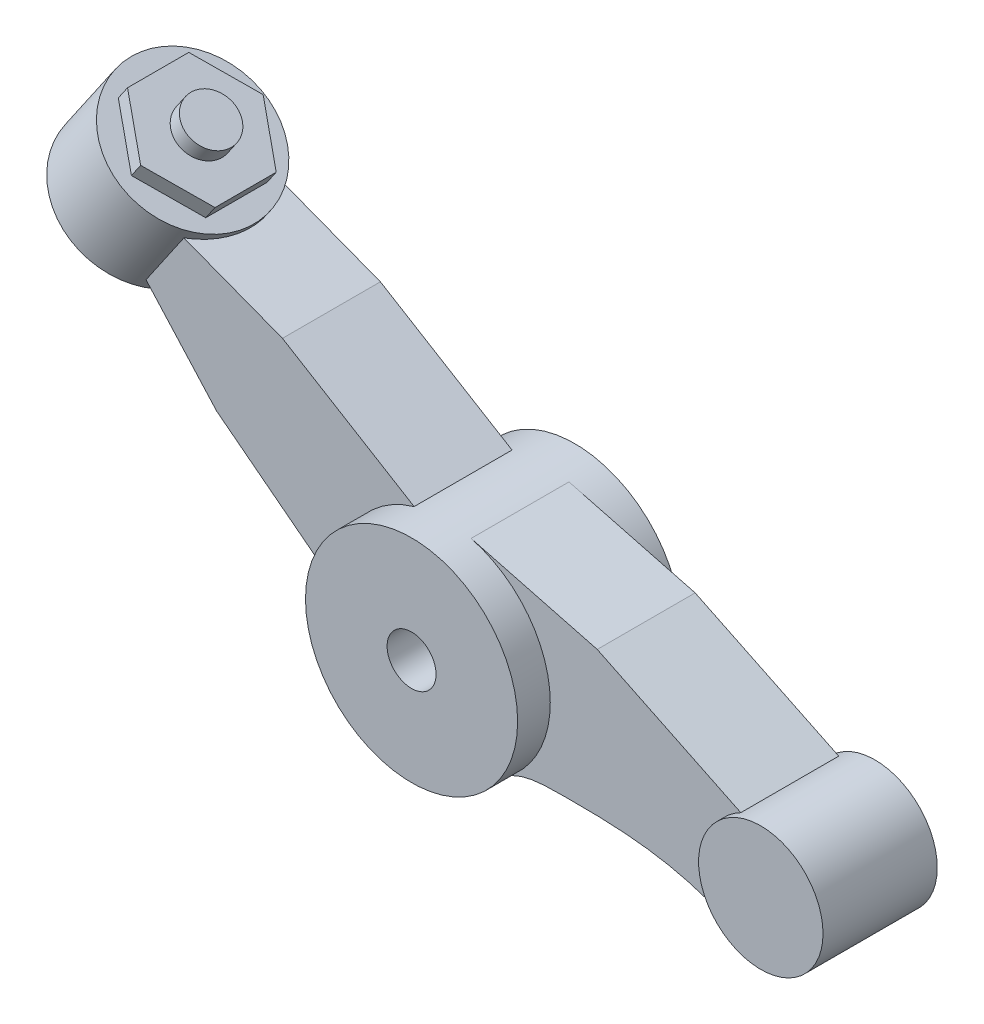
ISO-10303-21;
HEADER;
FILE_DESCRIPTION(('STEP AP214'),'2;1');
FILE_NAME('part.step','',(''),(''),'','','');
FILE_SCHEMA(('AUTOMOTIVE_DESIGN { 1 0 10303 214 1 1 1 1 }'));
ENDSEC;
DATA;
#1=APPLICATION_CONTEXT('core data for automotive mechanical design processes');
#2=APPLICATION_PROTOCOL_DEFINITION('international standard','automotive_design',2000,#1);
#3=PRODUCT_CONTEXT('',#1,'mechanical');
#4=PRODUCT('Part','Part','',(#3));
#5=PRODUCT_RELATED_PRODUCT_CATEGORY('part','',(#4));
#6=PRODUCT_DEFINITION_FORMATION('','',#4);
#7=PRODUCT_DEFINITION_CONTEXT('part definition',#1,'design');
#8=PRODUCT_DEFINITION('design','',#6,#7);
#9=PRODUCT_DEFINITION_SHAPE('','',#8);
#10=(LENGTH_UNIT() NAMED_UNIT(*) SI_UNIT(.MILLI.,.METRE.));
#11=(NAMED_UNIT(*) PLANE_ANGLE_UNIT() SI_UNIT($,.RADIAN.));
#12=(NAMED_UNIT(*) SI_UNIT($,.STERADIAN.) SOLID_ANGLE_UNIT());
#13=UNCERTAINTY_MEASURE_WITH_UNIT(LENGTH_MEASURE(1.E-05),#10,'distance_accuracy_value','');
#14=(GEOMETRIC_REPRESENTATION_CONTEXT(3) GLOBAL_UNCERTAINTY_ASSIGNED_CONTEXT((#13)) GLOBAL_UNIT_ASSIGNED_CONTEXT((#10,
#11,#12)) REPRESENTATION_CONTEXT('',''));
#15=CARTESIAN_POINT('',(0.,0.,0.));
#16=DIRECTION('',(0.,0.,1.));
#17=DIRECTION('',(1.,0.,0.));
#18=AXIS2_PLACEMENT_3D('',#15,#16,#17);
#19=CARTESIAN_POINT('',(-4.4329772935312,3.69336884842477,0.));
#20=DIRECTION('',(0.565974647839504,0.824422645251178,0.));
#21=DIRECTION('',(-0.824422645251178,0.565974647839504,0.));
#22=AXIS2_PLACEMENT_3D('',#19,#20,#21);
#23=PLANE('',#22);
#24=CARTESIAN_POINT('',(-3.68275268635263,3.17833191889082,0.));
#25=DIRECTION('',(0.565974647839504,0.824422645251178,0.));
#26=DIRECTION('',(-0.824422645251178,0.565974647839504,0.));
#27=AXIS2_PLACEMENT_3D('',#24,#25,#26);
#28=CIRCLE('',#27,0.91);
#29=CARTESIAN_POINT('',(-4.4329772935312,3.69336884842477,0.));
#30=VERTEX_POINT('',#29);
#31=EDGE_CURVE('E186',#30,#30,#28,.T.);
#32=ORIENTED_EDGE('',*,*,#31,.T.);
#33=EDGE_LOOP('',(#32));
#34=FACE_BOUND('',#33,.T.);
#35=DIRECTION('',(0.713970954242686,-0.490148422926962,-0.5));
#36=VECTOR('',#35,1.);
#37=CARTESIAN_POINT('',(-4.51335850144319,3.74855137658912,-0.168874953737966));
#38=LINE('',#37,#36);
#39=CARTESIAN_POINT('',(-4.2186274057659,3.5462154399865,-0.375277674973257));
#40=VERTEX_POINT('',#39);
#41=CARTESIAN_POINT('',(-3.68275268635263,3.17833191889082,-0.750555349946514));
#42=VERTEX_POINT('',#41);
#43=EDGE_CURVE('E44',#40,#42,#38,.T.);
#44=ORIENTED_EDGE('',*,*,#43,.T.);
#45=DIRECTION('',(0.713970954242686,-0.490148422926962,0.5));
#46=VECTOR('',#45,1.);
#47=CARTESIAN_POINT('',(-3.97748378202993,3.38066785549344,-0.956958071181804));
#48=LINE('',#47,#46);
#49=CARTESIAN_POINT('',(-3.14687796693936,2.81044839779514,-0.375277674973257));
#50=VERTEX_POINT('',#49);
#51=EDGE_CURVE('E11',#42,#50,#48,.T.);
#52=ORIENTED_EDGE('',*,*,#51,.T.);
#53=DIRECTION('',(0.,0.,1.));
#54=VECTOR('',#53,1.);
#55=CARTESIAN_POINT('',(-3.14687796693936,2.81044839779514,0.));
#56=LINE('',#55,#54);
#57=CARTESIAN_POINT('',(-3.14687796693936,2.81044839779514,0.375277674973257));
#58=VERTEX_POINT('',#57);
#59=EDGE_CURVE('E380',#50,#58,#56,.T.);
#60=ORIENTED_EDGE('',*,*,#59,.T.);
#61=DIRECTION('',(-0.713970954242686,0.490148422926962,0.5));
#62=VECTOR('',#61,1.);
#63=CARTESIAN_POINT('',(-3.97748378202993,3.38066785549344,0.956958071181805));
#64=LINE('',#63,#62);
#65=CARTESIAN_POINT('',(-3.68275268635263,3.17833191889082,0.750555349946513));
#66=VERTEX_POINT('',#65);
#67=EDGE_CURVE('E385',#58,#66,#64,.T.);
#68=ORIENTED_EDGE('',*,*,#67,.T.);
#69=DIRECTION('',(-0.713970954242686,0.490148422926962,-0.5));
#70=VECTOR('',#69,1.);
#71=CARTESIAN_POINT('',(-4.51335850144319,3.74855137658912,0.168874953737965));
#72=LINE('',#71,#70);
#73=CARTESIAN_POINT('',(-4.2186274057659,3.5462154399865,0.375277674973256));
#74=VERTEX_POINT('',#73);
#75=EDGE_CURVE('E388',#66,#74,#72,.T.);
#76=ORIENTED_EDGE('',*,*,#75,.T.);
#77=DIRECTION('',(0.,0.,-1.));
#78=VECTOR('',#77,1.);
#79=CARTESIAN_POINT('',(-4.2186274057659,3.5462154399865,0.));
#80=LINE('',#79,#78);
#81=EDGE_CURVE('E391',#74,#40,#80,.T.);
#82=ORIENTED_EDGE('',*,*,#81,.T.);
#83=EDGE_LOOP('',(#44,#52,#60,#68,#76,#82));
#84=FACE_BOUND('',#83,.T.);
#85=ADVANCED_FACE('F35',(#34,#84),#23,.T.);
#86=CARTESIAN_POINT('',(0.,0.,1.));
#87=DIRECTION('',(0.,0.,-1.));
#88=DIRECTION('',(-1.,0.,0.));
#89=AXIS2_PLACEMENT_3D('',#86,#87,#88);
#90=CYLINDRICAL_SURFACE('',#89,0.3);
#91=CARTESIAN_POINT('',(0.,0.,1.));
#92=DIRECTION('',(0.,0.,1.));
#93=DIRECTION('',(1.,0.,0.));
#94=AXIS2_PLACEMENT_3D('',#91,#92,#93);
#95=CIRCLE('',#94,0.3);
#96=CARTESIAN_POINT('',(0.3,0.,1.));
#97=VERTEX_POINT('',#96);
#98=EDGE_CURVE('E367',#97,#97,#95,.T.);
#99=ORIENTED_EDGE('',*,*,#98,.T.);
#100=EDGE_LOOP('',(#99));
#101=FACE_BOUND('',#100,.T.);
#102=CARTESIAN_POINT('',(0.,0.,-1.));
#103=DIRECTION('',(0.,0.,1.));
#104=DIRECTION('',(1.,0.,0.));
#105=AXIS2_PLACEMENT_3D('',#102,#103,#104);
#106=CIRCLE('',#105,0.3);
#107=CARTESIAN_POINT('',(0.3,0.,-1.));
#108=VERTEX_POINT('',#107);
#109=EDGE_CURVE('E366',#108,#108,#106,.T.);
#110=ORIENTED_EDGE('',*,*,#109,.F.);
#111=EDGE_LOOP('',(#110));
#112=FACE_BOUND('',#111,.T.);
#113=ADVANCED_FACE('F37',(#101,#112),#90,.F.);
#114=CARTESIAN_POINT('',(0.,0.,1.));
#115=DIRECTION('',(0.,0.,-1.));
#116=DIRECTION('',(-1.,0.,0.));
#117=AXIS2_PLACEMENT_3D('',#114,#115,#116);
#118=CYLINDRICAL_SURFACE('',#117,1.3);
#119=DIRECTION('',(0.,0.,-1.));
#120=VECTOR('',#119,1.);
#121=CARTESIAN_POINT('',(-0.368782160994087,1.24659525016444,0.6));
#122=LINE('',#121,#120);
#123=CARTESIAN_POINT('',(-0.368782160994086,1.24659525016444,0.6));
#124=VERTEX_POINT('',#123);
#125=CARTESIAN_POINT('',(-0.368782160994086,1.24659525016444,-0.6));
#126=VERTEX_POINT('',#125);
#127=EDGE_CURVE('E231',#124,#126,#122,.T.);
#128=ORIENTED_EDGE('',*,*,#127,.F.);
#129=CARTESIAN_POINT('',(0.,0.,0.6));
#130=DIRECTION('',(0.,0.,1.));
#131=DIRECTION('',(1.,0.,0.));
#132=AXIS2_PLACEMENT_3D('',#129,#130,#131);
#133=CIRCLE('',#132,1.3);
#134=CARTESIAN_POINT('',(-1.29584863415519,-0.103809042756995,0.6));
#135=VERTEX_POINT('',#134);
#136=EDGE_CURVE('E199',#124,#135,#133,.T.);
#137=ORIENTED_EDGE('',*,*,#136,.T.);
#138=DIRECTION('',(0.,0.,-1.));
#139=VECTOR('',#138,1.);
#140=CARTESIAN_POINT('',(-1.29584863415519,-0.103809042756995,0.6));
#141=LINE('',#140,#139);
#142=CARTESIAN_POINT('',(-1.29584863415519,-0.103809042756995,-0.6));
#143=VERTEX_POINT('',#142);
#144=EDGE_CURVE('E212',#135,#143,#141,.T.);
#145=ORIENTED_EDGE('',*,*,#144,.T.);
#146=CARTESIAN_POINT('',(0.,0.,-0.6));
#147=DIRECTION('',(0.,0.,1.));
#148=DIRECTION('',(1.,0.,0.));
#149=AXIS2_PLACEMENT_3D('',#146,#147,#148);
#150=CIRCLE('',#149,1.3);
#151=EDGE_CURVE('E198',#126,#143,#150,.T.);
#152=ORIENTED_EDGE('',*,*,#151,.F.);
#153=EDGE_LOOP('',(#128,#137,#145,#152));
#154=FACE_BOUND('',#153,.T.);
#155=DIRECTION('',(0.,0.,-1.));
#156=VECTOR('',#155,1.);
#157=CARTESIAN_POINT('',(0.765101996622916,-1.05100853220306,0.6));
#158=LINE('',#157,#156);
#159=CARTESIAN_POINT('',(0.765101996622916,-1.05100853220306,0.6));
#160=VERTEX_POINT('',#159);
#161=CARTESIAN_POINT('',(0.765101996622916,-1.05100853220306,-0.6));
#162=VERTEX_POINT('',#161);
#163=EDGE_CURVE('E356',#160,#162,#158,.T.);
#164=ORIENTED_EDGE('',*,*,#163,.F.);
#165=CARTESIAN_POINT('',(0.,0.,0.6));
#166=DIRECTION('',(0.,0.,1.));
#167=DIRECTION('',(1.,0.,0.));
#168=AXIS2_PLACEMENT_3D('',#165,#166,#167);
#169=CIRCLE('',#168,1.3);
#170=CARTESIAN_POINT('',(0.32933080886477,1.25759342330201,0.6));
#171=VERTEX_POINT('',#170);
#172=EDGE_CURVE('E358',#160,#171,#169,.T.);
#173=ORIENTED_EDGE('',*,*,#172,.T.);
#174=DIRECTION('',(0.,0.,-1.));
#175=VECTOR('',#174,1.);
#176=CARTESIAN_POINT('',(0.329330808864769,1.25759342330201,0.6));
#177=LINE('',#176,#175);
#178=CARTESIAN_POINT('',(0.329330808864769,1.25759342330201,-0.6));
#179=VERTEX_POINT('',#178);
#180=EDGE_CURVE('E343',#171,#179,#177,.T.);
#181=ORIENTED_EDGE('',*,*,#180,.T.);
#182=CARTESIAN_POINT('',(0.,0.,-0.6));
#183=DIRECTION('',(0.,0.,1.));
#184=DIRECTION('',(1.,0.,0.));
#185=AXIS2_PLACEMENT_3D('',#182,#183,#184);
#186=CIRCLE('',#185,1.3);
#187=EDGE_CURVE('E248',#162,#179,#186,.T.);
#188=ORIENTED_EDGE('',*,*,#187,.F.);
#189=EDGE_LOOP('',(#164,#173,#181,#188));
#190=FACE_BOUND('',#189,.T.);
#191=CARTESIAN_POINT('',(0.,0.,1.));
#192=DIRECTION('',(0.,0.,1.));
#193=DIRECTION('',(1.,0.,0.));
#194=AXIS2_PLACEMENT_3D('',#191,#192,#193);
#195=CIRCLE('',#194,1.3);
#196=CARTESIAN_POINT('',(1.3,0.,1.));
#197=VERTEX_POINT('',#196);
#198=EDGE_CURVE('E370',#197,#197,#195,.T.);
#199=ORIENTED_EDGE('',*,*,#198,.F.);
#200=EDGE_LOOP('',(#199));
#201=FACE_BOUND('',#200,.T.);
#202=CARTESIAN_POINT('',(0.,0.,-1.));
#203=DIRECTION('',(0.,0.,1.));
#204=DIRECTION('',(1.,0.,0.));
#205=AXIS2_PLACEMENT_3D('',#202,#203,#204);
#206=CIRCLE('',#205,1.3);
#207=CARTESIAN_POINT('',(1.3,0.,-1.));
#208=VERTEX_POINT('',#207);
#209=EDGE_CURVE('E371',#208,#208,#206,.T.);
#210=ORIENTED_EDGE('',*,*,#209,.T.);
#211=EDGE_LOOP('',(#210));
#212=FACE_BOUND('',#211,.T.);
#213=ADVANCED_FACE('F265',(#154,#190,#201,#212),#118,.T.);
#214=CARTESIAN_POINT('',(0.,0.,1.));
#215=DIRECTION('',(0.,0.,1.));
#216=DIRECTION('',(1.,0.,0.));
#217=AXIS2_PLACEMENT_3D('',#214,#215,#216);
#218=PLANE('',#217);
#219=ORIENTED_EDGE('',*,*,#98,.F.);
#220=EDGE_LOOP('',(#219));
#221=FACE_BOUND('',#220,.T.);
#222=ORIENTED_EDGE('',*,*,#198,.T.);
#223=EDGE_LOOP('',(#222));
#224=FACE_BOUND('',#223,.T.);
#225=ADVANCED_FACE('F262',(#221,#224),#218,.T.);
#226=CARTESIAN_POINT('',(0.,0.,-1.));
#227=DIRECTION('',(0.,0.,1.));
#228=DIRECTION('',(1.,0.,0.));
#229=AXIS2_PLACEMENT_3D('',#226,#227,#228);
#230=PLANE('',#229);
#231=ORIENTED_EDGE('',*,*,#109,.T.);
#232=EDGE_LOOP('',(#231));
#233=FACE_BOUND('',#232,.T.);
#234=ORIENTED_EDGE('',*,*,#209,.F.);
#235=EDGE_LOOP('',(#234));
#236=FACE_BOUND('',#235,.T.);
#237=ADVANCED_FACE('F259',(#233,#236),#230,.F.);
#238=CARTESIAN_POINT('',(3.43293190665739,-1.21115228630449,0.6));
#239=CARTESIAN_POINT('',(2.78269613377423,-0.92746391168016,0.6));
#240=CARTESIAN_POINT('',(1.9246700504407,-0.895659574924272,0.6));
#241=CARTESIAN_POINT('',(0.949941147115926,-0.916451296211978,0.6));
#242=CARTESIAN_POINT('',(0.765101996622916,-1.05100853220306,0.6));
#243=B_SPLINE_CURVE_WITH_KNOTS('',3,(#238,#239,#240,#241,#242),.UNSPECIFIED.,.F.,.F.,(4,1,4),
(0.,0.749641012163795,1.),.UNSPECIFIED.);
#244=DIRECTION('',(0.,0.,-1.));
#245=VECTOR('',#244,1.);
#246=SURFACE_OF_LINEAR_EXTRUSION('',#243,#245);
#247=CARTESIAN_POINT('',(3.43293190665739,-1.21115228630449,-0.6));
#248=CARTESIAN_POINT('',(2.78269613377423,-0.92746391168016,-0.6));
#249=CARTESIAN_POINT('',(1.9246700504407,-0.895659574924272,-0.6));
#250=CARTESIAN_POINT('',(0.949941147115926,-0.916451296211978,-0.6));
#251=CARTESIAN_POINT('',(0.765101996622916,-1.05100853220306,-0.6));
#252=B_SPLINE_CURVE_WITH_KNOTS('',3,(#247,#248,#249,#250,#251),.UNSPECIFIED.,.F.,.F.,(4,1,4),
(0.,0.749641012163795,1.),.UNSPECIFIED.);
#253=CARTESIAN_POINT('',(3.43293190665739,-1.21115228630449,-0.6));
#254=VERTEX_POINT('',#253);
#255=EDGE_CURVE('E238',#254,#162,#252,.T.);
#256=ORIENTED_EDGE('',*,*,#255,.F.);
#257=DIRECTION('',(0.,0.,-1.));
#258=VECTOR('',#257,1.);
#259=CARTESIAN_POINT('',(3.43293190665739,-1.21115228630449,0.6));
#260=LINE('',#259,#258);
#261=CARTESIAN_POINT('',(3.43293190665739,-1.21115228630449,0.6));
#262=VERTEX_POINT('',#261);
#263=EDGE_CURVE('E364',#262,#254,#260,.T.);
#264=ORIENTED_EDGE('',*,*,#263,.F.);
#265=EDGE_CURVE('E241',#262,#160,#243,.T.);
#266=ORIENTED_EDGE('',*,*,#265,.T.);
#267=ORIENTED_EDGE('',*,*,#163,.T.);
#268=EDGE_LOOP('',(#256,#264,#266,#267));
#269=FACE_BOUND('',#268,.T.);
#270=ADVANCED_FACE('F254',(#269),#246,.T.);
#271=CARTESIAN_POINT('',(0.691258883765189,1.42650130846445,0.6));
#272=DIRECTION('',(-0.436080364362982,-0.899907726279227,0.));
#273=DIRECTION('',(0.899907726279228,-0.436080364362982,0.));
#274=AXIS2_PLACEMENT_3D('',#271,#272,#273);
#275=PLANE('',#274);
#276=DIRECTION('',(-0.899907726279228,0.436080364362982,0.));
#277=VECTOR('',#276,1.);
#278=CARTESIAN_POINT('',(0.691258883765189,1.42650130846445,-0.6));
#279=LINE('',#278,#277);
#280=CARTESIAN_POINT('',(3.6350271749833,0.,-0.6));
#281=VERTEX_POINT('',#280);
#282=CARTESIAN_POINT('',(1.87525539926742,0.852756226822038,-0.6));
#283=VERTEX_POINT('',#282);
#284=EDGE_CURVE('E347',#281,#283,#279,.T.);
#285=ORIENTED_EDGE('',*,*,#284,.T.);
#286=DIRECTION('',(0.,0.,-1.));
#287=VECTOR('',#286,1.);
#288=CARTESIAN_POINT('',(1.87525539926742,0.852756226822038,0.6));
#289=LINE('',#288,#287);
#290=CARTESIAN_POINT('',(1.87525539926742,0.852756226822038,0.6));
#291=VERTEX_POINT('',#290);
#292=EDGE_CURVE('E345',#291,#283,#289,.T.);
#293=ORIENTED_EDGE('',*,*,#292,.F.);
#294=DIRECTION('',(-0.899907726279228,0.436080364362982,0.));
#295=VECTOR('',#294,1.);
#296=CARTESIAN_POINT('',(0.691258883765189,1.42650130846445,0.6));
#297=LINE('',#296,#295);
#298=CARTESIAN_POINT('',(3.6350271749833,0.,0.6));
#299=VERTEX_POINT('',#298);
#300=EDGE_CURVE('E692',#299,#291,#297,.T.);
#301=ORIENTED_EDGE('',*,*,#300,.F.);
#302=DIRECTION('',(0.,0.,-1.));
#303=VECTOR('',#302,1.);
#304=CARTESIAN_POINT('',(3.6350271749833,0.,0.6));
#305=LINE('',#304,#303);
#306=EDGE_CURVE('E361',#299,#281,#305,.T.);
#307=ORIENTED_EDGE('',*,*,#306,.T.);
#308=EDGE_LOOP('',(#285,#293,#301,#307));
#309=FACE_BOUND('',#308,.T.);
#310=ADVANCED_FACE('F258',(#309),#275,.F.);
#311=CARTESIAN_POINT('',(0.32933080886477,1.25759342330201,0.6));
#312=DIRECTION('',(-0.253331391434438,-0.967379556386164,0.));
#313=DIRECTION('',(0.967379556386164,-0.253331391434438,0.));
#314=AXIS2_PLACEMENT_3D('',#311,#312,#313);
#315=PLANE('',#314);
#316=DIRECTION('',(-0.967379556386164,0.253331391434438,0.));
#317=VECTOR('',#316,1.);
#318=CARTESIAN_POINT('',(0.32933080886477,1.25759342330201,-0.6));
#319=LINE('',#318,#317);
#320=EDGE_CURVE('E340',#283,#179,#319,.T.);
#321=ORIENTED_EDGE('',*,*,#320,.T.);
#322=ORIENTED_EDGE('',*,*,#180,.F.);
#323=DIRECTION('',(-0.967379556386164,0.253331391434438,0.));
#324=VECTOR('',#323,1.);
#325=CARTESIAN_POINT('',(0.32933080886477,1.25759342330201,0.6));
#326=LINE('',#325,#324);
#327=EDGE_CURVE('E690',#291,#171,#326,.T.);
#328=ORIENTED_EDGE('',*,*,#327,.F.);
#329=ORIENTED_EDGE('',*,*,#292,.T.);
#330=EDGE_LOOP('',(#321,#322,#328,#329));
#331=FACE_BOUND('',#330,.T.);
#332=ADVANCED_FACE('F326',(#331),#315,.F.);
#333=CARTESIAN_POINT('',(0.,0.,0.6));
#334=DIRECTION('',(0.,0.,1.));
#335=DIRECTION('',(1.,0.,0.));
#336=AXIS2_PLACEMENT_3D('',#333,#334,#335);
#337=PLANE('',#336);
#338=ORIENTED_EDGE('',*,*,#265,.F.);
#339=CARTESIAN_POINT('',(3.98,-0.68,0.6));
#340=DIRECTION('',(0.,0.,1.));
#341=DIRECTION('',(1.,0.,0.));
#342=AXIS2_PLACEMENT_3D('',#339,#340,#341);
#343=CIRCLE('',#342,0.7625);
#344=EDGE_CURVE('E247',#299,#262,#343,.T.);
#345=ORIENTED_EDGE('',*,*,#344,.F.);
#346=ORIENTED_EDGE('',*,*,#300,.T.);
#347=ORIENTED_EDGE('',*,*,#327,.T.);
#348=ORIENTED_EDGE('',*,*,#172,.F.);
#349=EDGE_LOOP('',(#338,#345,#346,#347,#348));
#350=FACE_BOUND('',#349,.T.);
#351=ADVANCED_FACE('F323',(#350),#337,.T.);
#352=CARTESIAN_POINT('',(0.,0.,-0.6));
#353=DIRECTION('',(0.,0.,1.));
#354=DIRECTION('',(1.,0.,0.));
#355=AXIS2_PLACEMENT_3D('',#352,#353,#354);
#356=PLANE('',#355);
#357=ORIENTED_EDGE('',*,*,#255,.T.);
#358=ORIENTED_EDGE('',*,*,#187,.T.);
#359=ORIENTED_EDGE('',*,*,#320,.F.);
#360=ORIENTED_EDGE('',*,*,#284,.F.);
#361=CARTESIAN_POINT('',(3.98,-0.68,-0.6));
#362=DIRECTION('',(0.,0.,1.));
#363=DIRECTION('',(1.,0.,0.));
#364=AXIS2_PLACEMENT_3D('',#361,#362,#363);
#365=CIRCLE('',#364,0.7625);
#366=EDGE_CURVE('E678',#281,#254,#365,.T.);
#367=ORIENTED_EDGE('',*,*,#366,.T.);
#368=EDGE_LOOP('',(#357,#358,#359,#360,#367));
#369=FACE_BOUND('',#368,.T.);
#370=ADVANCED_FACE('F321',(#369),#356,.F.);
#371=CARTESIAN_POINT('',(3.98,-0.68,0.7));
#372=DIRECTION('',(0.,0.,-1.));
#373=DIRECTION('',(-1.,0.,0.));
#374=AXIS2_PLACEMENT_3D('',#371,#372,#373);
#375=CYLINDRICAL_SURFACE('',#374,0.7625);
#376=ORIENTED_EDGE('',*,*,#344,.T.);
#377=ORIENTED_EDGE('',*,*,#263,.T.);
#378=ORIENTED_EDGE('',*,*,#366,.F.);
#379=ORIENTED_EDGE('',*,*,#306,.F.);
#380=EDGE_LOOP('',(#376,#377,#378,#379));
#381=FACE_BOUND('',#380,.T.);
#382=CARTESIAN_POINT('',(3.98,-0.68,0.7));
#383=DIRECTION('',(0.,0.,1.));
#384=DIRECTION('',(1.,0.,0.));
#385=AXIS2_PLACEMENT_3D('',#382,#383,#384);
#386=CIRCLE('',#385,0.7625);
#387=CARTESIAN_POINT('',(4.7425,-0.68,0.7));
#388=VERTEX_POINT('',#387);
#389=EDGE_CURVE('E235',#388,#388,#386,.T.);
#390=ORIENTED_EDGE('',*,*,#389,.F.);
#391=EDGE_LOOP('',(#390));
#392=FACE_BOUND('',#391,.T.);
#393=CARTESIAN_POINT('',(3.98,-0.68,-0.7));
#394=DIRECTION('',(0.,0.,1.));
#395=DIRECTION('',(1.,0.,0.));
#396=AXIS2_PLACEMENT_3D('',#393,#394,#395);
#397=CIRCLE('',#396,0.7625);
#398=CARTESIAN_POINT('',(4.7425,-0.68,-0.7));
#399=VERTEX_POINT('',#398);
#400=EDGE_CURVE('E234',#399,#399,#397,.T.);
#401=ORIENTED_EDGE('',*,*,#400,.T.);
#402=EDGE_LOOP('',(#401));
#403=FACE_BOUND('',#402,.T.);
#404=ADVANCED_FACE('F314',(#381,#392,#403),#375,.T.);
#405=CARTESIAN_POINT('',(0.,0.,0.7));
#406=DIRECTION('',(0.,0.,1.));
#407=DIRECTION('',(1.,0.,0.));
#408=AXIS2_PLACEMENT_3D('',#405,#406,#407);
#409=PLANE('',#408);
#410=ORIENTED_EDGE('',*,*,#389,.T.);
#411=EDGE_LOOP('',(#410));
#412=FACE_BOUND('',#411,.T.);
#413=ADVANCED_FACE('F311',(#412),#409,.T.);
#414=CARTESIAN_POINT('',(0.,0.,-0.7));
#415=DIRECTION('',(0.,0.,1.));
#416=DIRECTION('',(1.,0.,0.));
#417=AXIS2_PLACEMENT_3D('',#414,#415,#416);
#418=PLANE('',#417);
#419=ORIENTED_EDGE('',*,*,#400,.F.);
#420=EDGE_LOOP('',(#419));
#421=FACE_BOUND('',#420,.T.);
#422=ADVANCED_FACE('F309',(#421),#418,.F.);
#423=CARTESIAN_POINT('',(0.45361206525151,0.747603642695811,0.6));
#424=DIRECTION('',(0.518735678530968,0.854934673421903,0.));
#425=DIRECTION('',(-0.854934673421903,0.518735678530968,0.));
#426=AXIS2_PLACEMENT_3D('',#423,#424,#425);
#427=PLANE('',#426);
#428=DIRECTION('',(0.854934673421903,-0.518735678530968,0.));
#429=VECTOR('',#428,1.);
#430=CARTESIAN_POINT('',(0.45361206525151,0.747603642695811,-0.6));
#431=LINE('',#430,#429);
#432=CARTESIAN_POINT('',(-1.9821949842316,2.2255411528529,-0.6));
#433=VERTEX_POINT('',#432);
#434=EDGE_CURVE('E215',#433,#126,#431,.T.);
#435=ORIENTED_EDGE('',*,*,#434,.F.);
#436=DIRECTION('',(0.,0.,-1.));
#437=VECTOR('',#436,1.);
#438=CARTESIAN_POINT('',(-1.9821949842316,2.2255411528529,0.6));
#439=LINE('',#438,#437);
#440=CARTESIAN_POINT('',(-1.9821949842316,2.2255411528529,0.6));
#441=VERTEX_POINT('',#440);
#442=EDGE_CURVE('E228',#441,#433,#439,.T.);
#443=ORIENTED_EDGE('',*,*,#442,.F.);
#444=DIRECTION('',(0.854934673421903,-0.518735678530968,0.));
#445=VECTOR('',#444,1.);
#446=CARTESIAN_POINT('',(0.45361206525151,0.747603642695811,0.6));
#447=LINE('',#446,#445);
#448=EDGE_CURVE('E201',#441,#124,#447,.T.);
#449=ORIENTED_EDGE('',*,*,#448,.T.);
#450=ORIENTED_EDGE('',*,*,#127,.T.);
#451=EDGE_LOOP('',(#435,#443,#449,#450));
#452=FACE_BOUND('',#451,.T.);
#453=ADVANCED_FACE('F305',(#452),#427,.T.);
#454=CARTESIAN_POINT('',(0.489501886245422,1.28116913768826,0.6));
#455=DIRECTION('',(0.356910419352875,0.934138615280064,0.));
#456=DIRECTION('',(-0.934138615280064,0.356910419352875,0.));
#457=AXIS2_PLACEMENT_3D('',#454,#455,#456);
#458=PLANE('',#457);
#459=CARTESIAN_POINT('',(-3.84756940660758,2.93825290296157,0.));
#460=DIRECTION('',(0.356910419352875,0.934138615280064,0.));
#461=DIRECTION('',(0.934138615280064,-0.356910419352875,0.));
#462=AXIS2_PLACEMENT_3D('',#459,#460,#461);
#463=ELLIPSE('',#462,0.936091416623468,0.91);
#464=CARTESIAN_POINT('',(-3.19012729843187,2.68706112618347,0.6));
#465=VERTEX_POINT('',#464);
#466=CARTESIAN_POINT('',(-3.19012729843187,2.68706112618347,-0.6));
#467=VERTEX_POINT('',#466);
#468=EDGE_CURVE('E59',#465,#467,#463,.T.);
#469=ORIENTED_EDGE('',*,*,#468,.F.);
#470=DIRECTION('',(0.934138615280064,-0.356910419352875,0.));
#471=VECTOR('',#470,1.);
#472=CARTESIAN_POINT('',(0.489501886245422,1.28116913768826,0.6));
#473=LINE('',#472,#471);
#474=EDGE_CURVE('E205',#465,#441,#473,.T.);
#475=ORIENTED_EDGE('',*,*,#474,.T.);
#476=ORIENTED_EDGE('',*,*,#442,.T.);
#477=DIRECTION('',(0.934138615280064,-0.356910419352875,0.));
#478=VECTOR('',#477,1.);
#479=CARTESIAN_POINT('',(0.489501886245422,1.28116913768826,-0.6));
#480=LINE('',#479,#478);
#481=EDGE_CURVE('E218',#467,#433,#480,.T.);
#482=ORIENTED_EDGE('',*,*,#481,.F.);
#483=EDGE_LOOP('',(#469,#475,#476,#482));
#484=FACE_BOUND('',#483,.T.);
#485=ADVANCED_FACE('F301',(#484),#458,.T.);
#486=CARTESIAN_POINT('',(-1.01969272531976,-0.917187659060386,0.6));
#487=DIRECTION('',(0.743488367320575,0.668748867407628,0.));
#488=DIRECTION('',(-0.668748867407628,0.743488367320576,0.));
#489=AXIS2_PLACEMENT_3D('',#486,#487,#488);
#490=PLANE('',#489);
#491=DIRECTION('',(0.668748867407628,-0.743488367320576,0.));
#492=VECTOR('',#491,1.);
#493=CARTESIAN_POINT('',(-1.01969272531976,-0.917187659060386,0.6));
#494=LINE('',#493,#492);
#495=CARTESIAN_POINT('',(-3.6539354484891,2.01145852910801,0.6));
#496=VERTEX_POINT('',#495);
#497=CARTESIAN_POINT('',(-2.78917795552933,1.05005557516924,0.6));
#498=VERTEX_POINT('',#497);
#499=EDGE_CURVE('E207',#496,#498,#494,.T.);
#500=ORIENTED_EDGE('',*,*,#499,.F.);
#501=CARTESIAN_POINT('',(-4.12459757297132,2.53472194164643,0.));
#502=DIRECTION('',(0.743488367320575,0.668748867407628,0.));
#503=DIRECTION('',(-0.668748867407628,0.743488367320576,0.));
#504=AXIS2_PLACEMENT_3D('',#501,#502,#503);
#505=ELLIPSE('',#504,0.936091416623468,0.91);
#506=CARTESIAN_POINT('',(-3.6539354484891,2.01145852910801,-0.6));
#507=VERTEX_POINT('',#506);
#508=EDGE_CURVE('E192',#496,#507,#505,.T.);
#509=ORIENTED_EDGE('',*,*,#508,.T.);
#510=DIRECTION('',(0.668748867407628,-0.743488367320576,0.));
#511=VECTOR('',#510,1.);
#512=CARTESIAN_POINT('',(-1.01969272531976,-0.917187659060386,-0.6));
#513=LINE('',#512,#511);
#514=CARTESIAN_POINT('',(-2.78917795552933,1.05005557516924,-0.6));
#515=VERTEX_POINT('',#514);
#516=EDGE_CURVE('E220',#507,#515,#513,.T.);
#517=ORIENTED_EDGE('',*,*,#516,.T.);
#518=DIRECTION('',(0.,0.,-1.));
#519=VECTOR('',#518,1.);
#520=CARTESIAN_POINT('',(-2.78917795552933,1.05005557516924,0.6));
#521=LINE('',#520,#519);
#522=EDGE_CURVE('E225',#498,#515,#521,.T.);
#523=ORIENTED_EDGE('',*,*,#522,.F.);
#524=EDGE_LOOP('',(#500,#509,#517,#523));
#525=FACE_BOUND('',#524,.T.);
#526=ADVANCED_FACE('F297',(#525),#490,.F.);
#527=CARTESIAN_POINT('',(-0.534663775516847,-0.691960807751318,0.6));
#528=DIRECTION('',(0.611423720012565,0.791303377097556,0.));
#529=DIRECTION('',(-0.791303377097556,0.611423720012565,0.));
#530=AXIS2_PLACEMENT_3D('',#527,#528,#529);
#531=PLANE('',#530);
#532=DIRECTION('',(0.791303377097556,-0.611423720012565,0.));
#533=VECTOR('',#532,1.);
#534=CARTESIAN_POINT('',(-0.534663775516847,-0.691960807751318,-0.6));
#535=LINE('',#534,#533);
#536=EDGE_CURVE('E202',#515,#143,#535,.T.);
#537=ORIENTED_EDGE('',*,*,#536,.T.);
#538=ORIENTED_EDGE('',*,*,#144,.F.);
#539=DIRECTION('',(0.791303377097556,-0.611423720012565,0.));
#540=VECTOR('',#539,1.);
#541=CARTESIAN_POINT('',(-0.534663775516847,-0.691960807751318,0.6));
#542=LINE('',#541,#540);
#543=EDGE_CURVE('E209',#498,#135,#542,.T.);
#544=ORIENTED_EDGE('',*,*,#543,.F.);
#545=ORIENTED_EDGE('',*,*,#522,.T.);
#546=EDGE_LOOP('',(#537,#538,#544,#545));
#547=FACE_BOUND('',#546,.T.);
#548=ADVANCED_FACE('F290',(#547),#531,.F.);
#549=CARTESIAN_POINT('',(0.,0.,0.6));
#550=DIRECTION('',(0.,0.,1.));
#551=DIRECTION('',(1.,0.,0.));
#552=AXIS2_PLACEMENT_3D('',#549,#550,#551);
#553=PLANE('',#552);
#554=DIRECTION('',(0.565974647839504,0.824422645251178,0.));
#555=VECTOR('',#554,1.);
#556=CARTESIAN_POINT('',(-3.11870057002367,2.79110432423256,0.6));
#557=LINE('',#556,#555);
#558=EDGE_CURVE('E196',#496,#465,#557,.T.);
#559=ORIENTED_EDGE('',*,*,#558,.F.);
#560=ORIENTED_EDGE('',*,*,#499,.T.);
#561=ORIENTED_EDGE('',*,*,#543,.T.);
#562=ORIENTED_EDGE('',*,*,#136,.F.);
#563=ORIENTED_EDGE('',*,*,#448,.F.);
#564=ORIENTED_EDGE('',*,*,#474,.F.);
#565=EDGE_LOOP('',(#559,#560,#561,#562,#563,#564));
#566=FACE_BOUND('',#565,.T.);
#567=ADVANCED_FACE('F286',(#566),#553,.T.);
#568=CARTESIAN_POINT('',(0.,0.,-0.6));
#569=DIRECTION('',(0.,0.,1.));
#570=DIRECTION('',(1.,0.,0.));
#571=AXIS2_PLACEMENT_3D('',#568,#569,#570);
#572=PLANE('',#571);
#573=ORIENTED_EDGE('',*,*,#516,.F.);
#574=DIRECTION('',(0.565974647839504,0.824422645251178,0.));
#575=VECTOR('',#574,1.);
#576=CARTESIAN_POINT('',(-3.11870057002367,2.79110432423256,-0.6));
#577=LINE('',#576,#575);
#578=EDGE_CURVE('E374',#507,#467,#577,.T.);
#579=ORIENTED_EDGE('',*,*,#578,.T.);
#580=ORIENTED_EDGE('',*,*,#481,.T.);
#581=ORIENTED_EDGE('',*,*,#434,.T.);
#582=ORIENTED_EDGE('',*,*,#151,.T.);
#583=ORIENTED_EDGE('',*,*,#536,.F.);
#584=EDGE_LOOP('',(#573,#579,#580,#581,#582,#583));
#585=FACE_BOUND('',#584,.T.);
#586=ADVANCED_FACE('F289',(#585),#572,.F.);
#587=CARTESIAN_POINT('',(-4.29174140742793,2.29125315260055,0.));
#588=DIRECTION('',(-0.565974647839504,-0.824422645251178,0.));
#589=DIRECTION('',(0.824422645251178,-0.565974647839504,0.));
#590=AXIS2_PLACEMENT_3D('',#587,#588,#589);
#591=PLANE('',#590);
#592=CARTESIAN_POINT('',(-4.29174140742793,2.29125315260055,0.));
#593=DIRECTION('',(-0.565974647839504,-0.824422645251178,0.));
#594=DIRECTION('',(0.824422645251178,-0.565974647839504,0.));
#595=AXIS2_PLACEMENT_3D('',#592,#593,#594);
#596=CIRCLE('',#595,0.268342888439798);
#597=CARTESIAN_POINT('',(-4.07051345350605,2.1393778808156,0.));
#598=VERTEX_POINT('',#597);
#599=EDGE_CURVE('E180',#598,#598,#596,.F.);
#600=ORIENTED_EDGE('',*,*,#599,.T.);
#601=EDGE_LOOP('',(#600));
#602=FACE_BOUND('',#601,.T.);
#603=CARTESIAN_POINT('',(-4.29174140742793,2.29125315260055,0.));
#604=DIRECTION('',(0.565974647839504,0.824422645251178,0.));
#605=DIRECTION('',(-0.824422645251178,0.565974647839504,0.));
#606=AXIS2_PLACEMENT_3D('',#603,#604,#605);
#607=CIRCLE('',#606,0.91);
#608=CARTESIAN_POINT('',(-5.04196601460651,2.8062900821345,0.));
#609=VERTEX_POINT('',#608);
#610=EDGE_CURVE('E189',#609,#609,#607,.T.);
#611=ORIENTED_EDGE('',*,*,#610,.F.);
#612=EDGE_LOOP('',(#611));
#613=FACE_BOUND('',#612,.T.);
#614=ADVANCED_FACE('F284',(#602,#613),#591,.T.);
#615=CARTESIAN_POINT('',(-3.68275268635263,3.17833191889082,0.));
#616=DIRECTION('',(0.565974647839504,0.824422645251178,0.));
#617=DIRECTION('',(-0.824422645251178,0.565974647839504,0.));
#618=AXIS2_PLACEMENT_3D('',#615,#616,#617);
#619=CYLINDRICAL_SURFACE('',#618,0.91);
#620=ORIENTED_EDGE('',*,*,#508,.F.);
#621=ORIENTED_EDGE('',*,*,#558,.T.);
#622=ORIENTED_EDGE('',*,*,#468,.T.);
#623=ORIENTED_EDGE('',*,*,#578,.F.);
#624=EDGE_LOOP('',(#620,#621,#622,#623));
#625=FACE_BOUND('',#624,.T.);
#626=ORIENTED_EDGE('',*,*,#610,.T.);
#627=EDGE_LOOP('',(#626));
#628=FACE_BOUND('',#627,.T.);
#629=ORIENTED_EDGE('',*,*,#31,.F.);
#630=EDGE_LOOP('',(#629));
#631=FACE_BOUND('',#630,.T.);
#632=ADVANCED_FACE('F444',(#625,#628,#631),#619,.T.);
#633=CARTESIAN_POINT('',(-4.44355713905914,2.07011192738858,0.));
#634=DIRECTION('',(0.565974647839503,0.824422645251179,0.));
#635=DIRECTION('',(-0.824422645251179,0.565974647839503,0.));
#636=AXIS2_PLACEMENT_3D('',#633,#634,#635);
#637=CONICAL_SURFACE('',#636,0.0985192542995596,0.564409104137141);
#638=ORIENTED_EDGE('',*,*,#599,.F.);
#639=EDGE_LOOP('',(#638));
#640=FACE_BOUND('',#639,.T.);
#641=CARTESIAN_POINT('',(-4.44355713905914,2.07011192738858,0.));
#642=DIRECTION('',(0.565974647839503,0.824422645251179,0.));
#643=DIRECTION('',(-0.824422645251179,0.565974647839503,0.));
#644=AXIS2_PLACEMENT_3D('',#641,#642,#643);
#645=CIRCLE('',#644,0.0985192542995593);
#646=CARTESIAN_POINT('',(-4.52477864329696,2.12587132764618,0.));
#647=VERTEX_POINT('',#646);
#648=EDGE_CURVE('E177',#647,#647,#645,.T.);
#649=ORIENTED_EDGE('',*,*,#648,.T.);
#650=EDGE_LOOP('',(#649));
#651=FACE_BOUND('',#650,.T.);
#652=ADVANCED_FACE('F441',(#640,#651),#637,.T.);
#653=CARTESIAN_POINT('',(-4.6336386578282,1.79323113579279,0.));
#654=DIRECTION('',(0.565974647839503,0.824422645251179,0.));
#655=DIRECTION('',(0.824422645251179,-0.565974647839503,0.));
#656=AXIS2_PLACEMENT_3D('',#653,#654,#655);
#657=SPHERICAL_SURFACE('',#656,0.35);
#658=ORIENTED_EDGE('',*,*,#648,.F.);
#659=EDGE_LOOP('',(#658));
#660=FACE_BOUND('',#659,.T.);
#661=ADVANCED_FACE('F438',(#660),#657,.T.);
#662=CARTESIAN_POINT('',(-3.03368303737146,2.97533292684538,-0.375277674973257));
#663=DIRECTION('',(-0.412211322625589,0.282987323919752,0.866025403784438));
#664=DIRECTION('',(0.902934052856613,0.,0.429779124890835));
#665=AXIS2_PLACEMENT_3D('',#662,#663,#664);
#666=PLANE('',#665);
#667=ORIENTED_EDGE('',*,*,#51,.F.);
#668=DIRECTION('',(-0.565974647839504,-0.824422645251178,0.));
#669=VECTOR('',#668,1.);
#670=CARTESIAN_POINT('',(-3.56955775678473,3.34321644794105,-0.750555349946514));
#671=LINE('',#670,#669);
#672=CARTESIAN_POINT('',(-3.56955775678473,3.34321644794105,-0.750555349946514));
#673=VERTEX_POINT('',#672);
#674=EDGE_CURVE('E160',#673,#42,#671,.T.);
#675=ORIENTED_EDGE('',*,*,#674,.F.);
#676=DIRECTION('',(-0.713970954242686,0.490148422926962,-0.5));
#677=VECTOR('',#676,1.);
#678=CARTESIAN_POINT('',(-3.03368303737146,2.97533292684538,-0.375277674973257));
#679=LINE('',#678,#677);
#680=CARTESIAN_POINT('',(-3.03368303737146,2.97533292684538,-0.375277674973257));
#681=VERTEX_POINT('',#680);
#682=EDGE_CURVE('E167',#681,#673,#679,.T.);
#683=ORIENTED_EDGE('',*,*,#682,.F.);
#684=DIRECTION('',(-0.565974647839504,-0.824422645251178,0.));
#685=VECTOR('',#684,1.);
#686=CARTESIAN_POINT('',(-3.03368303737146,2.97533292684538,-0.375277674973257));
#687=LINE('',#686,#685);
#688=EDGE_CURVE('E406',#681,#50,#687,.T.);
#689=ORIENTED_EDGE('',*,*,#688,.T.);
#690=EDGE_LOOP('',(#667,#675,#683,#689));
#691=FACE_BOUND('',#690,.T.);
#692=ADVANCED_FACE('F176',(#691),#666,.F.);
#693=CARTESIAN_POINT('',(-3.56955775678473,3.34321644794105,-0.750555349946514));
#694=DIRECTION('',(0.412211322625589,-0.282987323919752,0.866025403784439));
#695=DIRECTION('',(0.902934052856613,0.,-0.429779124890835));
#696=AXIS2_PLACEMENT_3D('',#693,#694,#695);
#697=PLANE('',#696);
#698=ORIENTED_EDGE('',*,*,#43,.F.);
#699=DIRECTION('',(-0.565974647839504,-0.824422645251178,0.));
#700=VECTOR('',#699,1.);
#701=CARTESIAN_POINT('',(-4.10543247619799,3.71109996903673,-0.375277674973257));
#702=LINE('',#701,#700);
#703=CARTESIAN_POINT('',(-4.10543247619799,3.71109996903673,-0.375277674973257));
#704=VERTEX_POINT('',#703);
#705=EDGE_CURVE('E163',#704,#40,#702,.T.);
#706=ORIENTED_EDGE('',*,*,#705,.F.);
#707=DIRECTION('',(-0.713970954242686,0.490148422926962,0.5));
#708=VECTOR('',#707,1.);
#709=CARTESIAN_POINT('',(-3.56955775678473,3.34321644794105,-0.750555349946514));
#710=LINE('',#709,#708);
#711=EDGE_CURVE('E156',#673,#704,#710,.T.);
#712=ORIENTED_EDGE('',*,*,#711,.F.);
#713=ORIENTED_EDGE('',*,*,#674,.T.);
#714=EDGE_LOOP('',(#698,#706,#712,#713));
#715=FACE_BOUND('',#714,.T.);
#716=ADVANCED_FACE('F158',(#715),#697,.F.);
#717=CARTESIAN_POINT('',(-4.10543247619799,3.71109996903673,-0.375277674973257));
#718=DIRECTION('',(0.824422645251178,-0.565974647839504,0.));
#719=DIRECTION('',(0.565974647839504,0.824422645251178,0.));
#720=AXIS2_PLACEMENT_3D('',#717,#718,#719);
#721=PLANE('',#720);
#722=ORIENTED_EDGE('',*,*,#81,.F.);
#723=DIRECTION('',(-0.565974647839504,-0.824422645251178,0.));
#724=VECTOR('',#723,1.);
#725=CARTESIAN_POINT('',(-4.10543247619799,3.71109996903673,0.375277674973256));
#726=LINE('',#725,#724);
#727=CARTESIAN_POINT('',(-4.10543247619799,3.71109996903673,0.375277674973256));
#728=VERTEX_POINT('',#727);
#729=EDGE_CURVE('E182',#728,#74,#726,.T.);
#730=ORIENTED_EDGE('',*,*,#729,.F.);
#731=DIRECTION('',(0.,0.,1.));
#732=VECTOR('',#731,1.);
#733=CARTESIAN_POINT('',(-4.10543247619799,3.71109996903673,-0.375277674973257));
#734=LINE('',#733,#732);
#735=EDGE_CURVE('E166',#704,#728,#734,.T.);
#736=ORIENTED_EDGE('',*,*,#735,.F.);
#737=ORIENTED_EDGE('',*,*,#705,.T.);
#738=EDGE_LOOP('',(#722,#730,#736,#737));
#739=FACE_BOUND('',#738,.T.);
#740=ADVANCED_FACE('F395',(#739),#721,.F.);
#741=CARTESIAN_POINT('',(-4.10543247619799,3.71109996903673,0.375277674973256));
#742=DIRECTION('',(0.412211322625589,-0.282987323919752,-0.866025403784438));
#743=DIRECTION('',(-0.902934052856613,0.,-0.429779124890835));
#744=AXIS2_PLACEMENT_3D('',#741,#742,#743);
#745=PLANE('',#744);
#746=ORIENTED_EDGE('',*,*,#75,.F.);
#747=DIRECTION('',(-0.565974647839504,-0.824422645251178,0.));
#748=VECTOR('',#747,1.);
#749=CARTESIAN_POINT('',(-3.56955775678473,3.34321644794105,0.750555349946513));
#750=LINE('',#749,#748);
#751=CARTESIAN_POINT('',(-3.56955775678473,3.34321644794105,0.750555349946513));
#752=VERTEX_POINT('',#751);
#753=EDGE_CURVE('E409',#752,#66,#750,.T.);
#754=ORIENTED_EDGE('',*,*,#753,.F.);
#755=DIRECTION('',(0.713970954242686,-0.490148422926962,0.5));
#756=VECTOR('',#755,1.);
#757=CARTESIAN_POINT('',(-4.10543247619799,3.71109996903673,0.375277674973256));
#758=LINE('',#757,#756);
#759=EDGE_CURVE('E399',#728,#752,#758,.T.);
#760=ORIENTED_EDGE('',*,*,#759,.F.);
#761=ORIENTED_EDGE('',*,*,#729,.T.);
#762=EDGE_LOOP('',(#746,#754,#760,#761));
#763=FACE_BOUND('',#762,.T.);
#764=ADVANCED_FACE('F412',(#763),#745,.F.);
#765=CARTESIAN_POINT('',(-3.56955775678473,3.34321644794105,0.750555349946513));
#766=DIRECTION('',(-0.412211322625589,0.282987323919752,-0.866025403784438));
#767=DIRECTION('',(-0.902934052856613,0.,0.429779124890835));
#768=AXIS2_PLACEMENT_3D('',#765,#766,#767);
#769=PLANE('',#768);
#770=ORIENTED_EDGE('',*,*,#67,.F.);
#771=DIRECTION('',(-0.565974647839504,-0.824422645251178,0.));
#772=VECTOR('',#771,1.);
#773=CARTESIAN_POINT('',(-3.03368303737146,2.97533292684538,0.375277674973257));
#774=LINE('',#773,#772);
#775=CARTESIAN_POINT('',(-3.03368303737146,2.97533292684538,0.375277674973257));
#776=VERTEX_POINT('',#775);
#777=EDGE_CURVE('E51',#776,#58,#774,.T.);
#778=ORIENTED_EDGE('',*,*,#777,.F.);
#779=DIRECTION('',(0.713970954242687,-0.490148422926961,-0.5));
#780=VECTOR('',#779,1.);
#781=CARTESIAN_POINT('',(-3.56955775678473,3.34321644794105,0.750555349946513));
#782=LINE('',#781,#780);
#783=EDGE_CURVE('E401',#752,#776,#782,.T.);
#784=ORIENTED_EDGE('',*,*,#783,.F.);
#785=ORIENTED_EDGE('',*,*,#753,.T.);
#786=EDGE_LOOP('',(#770,#778,#784,#785));
#787=FACE_BOUND('',#786,.T.);
#788=ADVANCED_FACE('F415',(#787),#769,.F.);
#789=CARTESIAN_POINT('',(-3.03368303737146,2.97533292684538,0.375277674973257));
#790=DIRECTION('',(-0.824422645251178,0.565974647839504,0.));
#791=DIRECTION('',(-0.565974647839504,-0.824422645251178,0.));
#792=AXIS2_PLACEMENT_3D('',#789,#790,#791);
#793=PLANE('',#792);
#794=ORIENTED_EDGE('',*,*,#59,.F.);
#795=ORIENTED_EDGE('',*,*,#688,.F.);
#796=DIRECTION('',(0.,0.,-1.));
#797=VECTOR('',#796,1.);
#798=CARTESIAN_POINT('',(-3.03368303737146,2.97533292684538,0.375277674973257));
#799=LINE('',#798,#797);
#800=EDGE_CURVE('E171',#776,#681,#799,.T.);
#801=ORIENTED_EDGE('',*,*,#800,.F.);
#802=ORIENTED_EDGE('',*,*,#777,.T.);
#803=EDGE_LOOP('',(#794,#795,#801,#802));
#804=FACE_BOUND('',#803,.T.);
#805=ADVANCED_FACE('F417',(#804),#793,.F.);
#806=CARTESIAN_POINT('',(0.416525733004718,0.606729025637052,0.));
#807=DIRECTION('',(0.565974647839504,0.824422645251178,0.));
#808=DIRECTION('',(-0.824422645251178,0.565974647839504,0.));
#809=AXIS2_PLACEMENT_3D('',#806,#807,#808);
#810=PLANE('',#809);
#811=CARTESIAN_POINT('',(-3.56955775678473,3.34321644794105,0.));
#812=DIRECTION('',(0.565974647839504,0.824422645251178,0.));
#813=DIRECTION('',(-0.824422645251178,0.565974647839504,0.));
#814=AXIS2_PLACEMENT_3D('',#811,#812,#813);
#815=CIRCLE('',#814,0.3);
#816=CARTESIAN_POINT('',(-3.81688455036008,3.5130088422929,0.));
#817=VERTEX_POINT('',#816);
#818=EDGE_CURVE('E39',#817,#817,#815,.F.);
#819=ORIENTED_EDGE('',*,*,#818,.T.);
#820=EDGE_LOOP('',(#819));
#821=FACE_BOUND('',#820,.T.);
#822=ORIENTED_EDGE('',*,*,#682,.T.);
#823=ORIENTED_EDGE('',*,*,#711,.T.);
#824=ORIENTED_EDGE('',*,*,#735,.T.);
#825=ORIENTED_EDGE('',*,*,#759,.T.);
#826=ORIENTED_EDGE('',*,*,#783,.T.);
#827=ORIENTED_EDGE('',*,*,#800,.T.);
#828=EDGE_LOOP('',(#822,#823,#824,#825,#826,#827));
#829=FACE_BOUND('',#828,.T.);
#830=ADVANCED_FACE('F170',(#821,#829),#810,.T.);
#831=CARTESIAN_POINT('',(-3.45636282721683,3.50810097699129,0.));
#832=DIRECTION('',(-0.565974647839504,-0.824422645251178,0.));
#833=DIRECTION('',(0.824422645251178,-0.565974647839504,0.));
#834=AXIS2_PLACEMENT_3D('',#831,#832,#833);
#835=CYLINDRICAL_SURFACE('',#834,0.3);
#836=ORIENTED_EDGE('',*,*,#818,.F.);
#837=EDGE_LOOP('',(#836));
#838=FACE_BOUND('',#837,.T.);
#839=CARTESIAN_POINT('',(-3.45636282721683,3.50810097699129,0.));
#840=DIRECTION('',(0.565974647839504,0.824422645251178,0.));
#841=DIRECTION('',(-0.824422645251178,0.565974647839504,0.));
#842=AXIS2_PLACEMENT_3D('',#839,#840,#841);
#843=CIRCLE('',#842,0.3);
#844=CARTESIAN_POINT('',(-3.70368962079218,3.67789337134314,0.));
#845=VERTEX_POINT('',#844);
#846=EDGE_CURVE('E655',#845,#845,#843,.T.);
#847=ORIENTED_EDGE('',*,*,#846,.F.);
#848=EDGE_LOOP('',(#847));
#849=FACE_BOUND('',#848,.T.);
#850=ADVANCED_FACE('F424',(#838,#849),#835,.T.);
#851=CARTESIAN_POINT('',(-3.45636282721683,3.50810097699129,0.));
#852=DIRECTION('',(0.565974647839504,0.824422645251178,0.));
#853=DIRECTION('',(-0.824422645251178,0.565974647839504,0.));
#854=AXIS2_PLACEMENT_3D('',#851,#852,#853);
#855=PLANE('',#854);
#856=ORIENTED_EDGE('',*,*,#846,.T.);
#857=EDGE_LOOP('',(#856));
#858=FACE_BOUND('',#857,.T.);
#859=ADVANCED_FACE('F640',(#858),#855,.T.);
#860=CLOSED_SHELL('',(#85,#113,#213,#225,#237,#270,#310,#332,#351,#370,#404,#413,#422,#453,#485,
#526,#548,#567,#586,#614,#632,#652,#661,#692,#716,#740,#764,#788,#805,#830,#850,#859));
#861=MANIFOLD_SOLID_BREP('B2',#860);
#862=ADVANCED_BREP_SHAPE_REPRESENTATION('',(#18,#861),#14);
#863=SHAPE_DEFINITION_REPRESENTATION(#9,#862);
ENDSEC;
END-ISO-10303-21;
